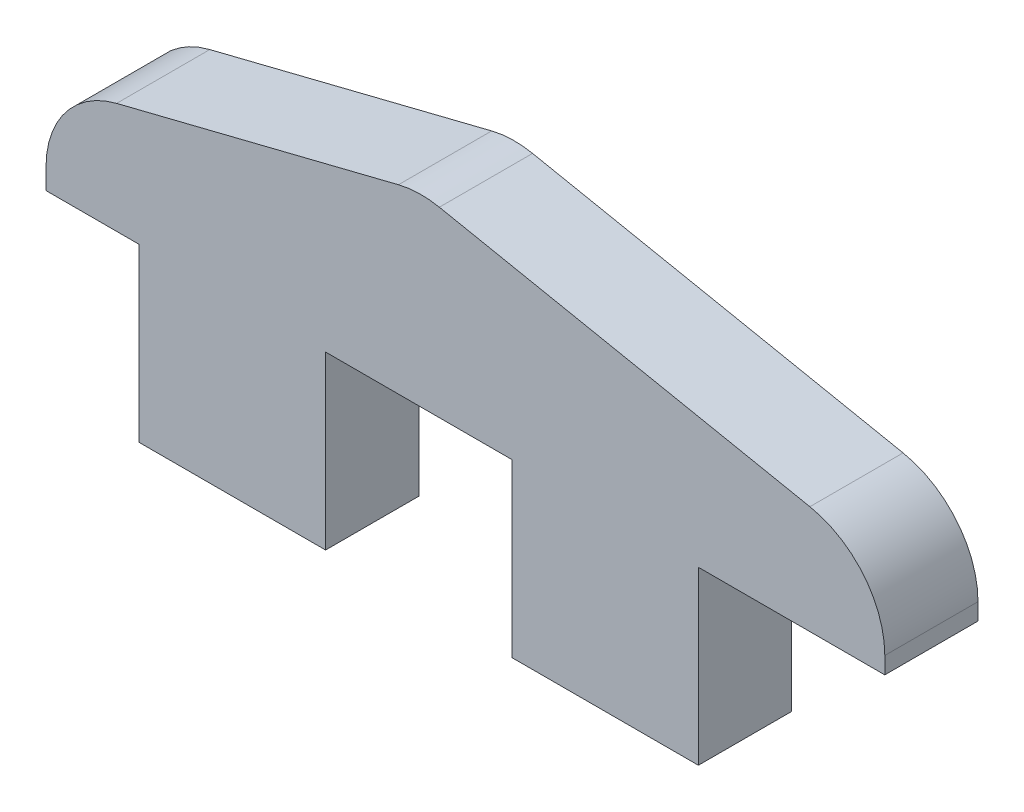
ISO-10303-21;
HEADER;
FILE_DESCRIPTION(('STEP AP214'),'2;1');
FILE_NAME('part.step','',(''),(''),'','','');
FILE_SCHEMA(('AUTOMOTIVE_DESIGN { 1 0 10303 214 1 1 1 1 }'));
ENDSEC;
DATA;
#1=APPLICATION_CONTEXT('core data for automotive mechanical design processes');
#2=APPLICATION_PROTOCOL_DEFINITION('international standard','automotive_design',2000,#1);
#3=PRODUCT_CONTEXT('',#1,'mechanical');
#4=PRODUCT('Part','Part','',(#3));
#5=PRODUCT_RELATED_PRODUCT_CATEGORY('part','',(#4));
#6=PRODUCT_DEFINITION_FORMATION('','',#4);
#7=PRODUCT_DEFINITION_CONTEXT('part definition',#1,'design');
#8=PRODUCT_DEFINITION('design','',#6,#7);
#9=PRODUCT_DEFINITION_SHAPE('','',#8);
#10=(LENGTH_UNIT() NAMED_UNIT(*) SI_UNIT(.MILLI.,.METRE.));
#11=(NAMED_UNIT(*) PLANE_ANGLE_UNIT() SI_UNIT($,.RADIAN.));
#12=(NAMED_UNIT(*) SI_UNIT($,.STERADIAN.) SOLID_ANGLE_UNIT());
#13=UNCERTAINTY_MEASURE_WITH_UNIT(LENGTH_MEASURE(1.E-05),#10,'distance_accuracy_value','');
#14=(GEOMETRIC_REPRESENTATION_CONTEXT(3) GLOBAL_UNCERTAINTY_ASSIGNED_CONTEXT((#13)) GLOBAL_UNIT_ASSIGNED_CONTEXT((#10,
#11,#12)) REPRESENTATION_CONTEXT('',''));
#15=CARTESIAN_POINT('',(0.,0.,0.));
#16=DIRECTION('',(0.,0.,1.));
#17=DIRECTION('',(1.,0.,0.));
#18=AXIS2_PLACEMENT_3D('',#15,#16,#17);
#19=CARTESIAN_POINT('',(0.,0.,3.175));
#20=DIRECTION('',(-1.,0.,0.));
#21=DIRECTION('',(0.,0.,1.));
#22=AXIS2_PLACEMENT_3D('',#19,#20,#21);
#23=PLANE('',#22);
#24=DIRECTION('',(0.,1.,0.));
#25=VECTOR('',#24,1.);
#26=CARTESIAN_POINT('',(0.,0.,0.));
#27=LINE('',#26,#25);
#28=CARTESIAN_POINT('',(0.,0.,0.));
#29=VERTEX_POINT('',#28);
#30=CARTESIAN_POINT('',(0.,5.842,0.));
#31=VERTEX_POINT('',#30);
#32=EDGE_CURVE('E172',#29,#31,#27,.T.);
#33=ORIENTED_EDGE('',*,*,#32,.T.);
#34=DIRECTION('',(0.,0.,-1.));
#35=VECTOR('',#34,1.);
#36=CARTESIAN_POINT('',(0.,5.842,3.175));
#37=LINE('',#36,#35);
#38=CARTESIAN_POINT('',(0.,5.842,3.175));
#39=VERTEX_POINT('',#38);
#40=EDGE_CURVE('E153',#39,#31,#37,.T.);
#41=ORIENTED_EDGE('',*,*,#40,.F.);
#42=DIRECTION('',(0.,1.,0.));
#43=VECTOR('',#42,1.);
#44=CARTESIAN_POINT('',(0.,0.,3.175));
#45=LINE('',#44,#43);
#46=CARTESIAN_POINT('',(0.,0.,3.175));
#47=VERTEX_POINT('',#46);
#48=EDGE_CURVE('E159',#47,#39,#45,.T.);
#49=ORIENTED_EDGE('',*,*,#48,.F.);
#50=DIRECTION('',(0.,0.,-1.));
#51=VECTOR('',#50,1.);
#52=CARTESIAN_POINT('',(0.,0.,3.175));
#53=LINE('',#52,#51);
#54=EDGE_CURVE('E225',#47,#29,#53,.T.);
#55=ORIENTED_EDGE('',*,*,#54,.T.);
#56=EDGE_LOOP('',(#33,#41,#49,#55));
#57=FACE_BOUND('',#56,.T.);
#58=ADVANCED_FACE('F35',(#57),#23,.F.);
#59=CARTESIAN_POINT('',(0.,5.842,3.175));
#60=DIRECTION('',(0.,1.,0.));
#61=DIRECTION('',(-1.,0.,0.));
#62=AXIS2_PLACEMENT_3D('',#59,#60,#61);
#63=PLANE('',#62);
#64=DIRECTION('',(1.,0.,0.));
#65=VECTOR('',#64,1.);
#66=CARTESIAN_POINT('',(0.,5.842,0.));
#67=LINE('',#66,#65);
#68=CARTESIAN_POINT('',(6.35,5.842,0.));
#69=VERTEX_POINT('',#68);
#70=EDGE_CURVE('E261',#31,#69,#67,.T.);
#71=ORIENTED_EDGE('',*,*,#70,.T.);
#72=DIRECTION('',(0.,0.,-1.));
#73=VECTOR('',#72,1.);
#74=CARTESIAN_POINT('',(6.35,5.842,3.175));
#75=LINE('',#74,#73);
#76=CARTESIAN_POINT('',(6.35,5.842,3.175));
#77=VERTEX_POINT('',#76);
#78=EDGE_CURVE('E156',#77,#69,#75,.T.);
#79=ORIENTED_EDGE('',*,*,#78,.F.);
#80=DIRECTION('',(1.,0.,0.));
#81=VECTOR('',#80,1.);
#82=CARTESIAN_POINT('',(0.,5.842,3.175));
#83=LINE('',#82,#81);
#84=EDGE_CURVE('E149',#39,#77,#83,.T.);
#85=ORIENTED_EDGE('',*,*,#84,.F.);
#86=ORIENTED_EDGE('',*,*,#40,.T.);
#87=EDGE_LOOP('',(#71,#79,#85,#86));
#88=FACE_BOUND('',#87,.T.);
#89=ADVANCED_FACE('F151',(#88),#63,.F.);
#90=CARTESIAN_POINT('',(6.35,0.,3.175));
#91=DIRECTION('',(1.,0.,0.));
#92=DIRECTION('',(0.,0.,-1.));
#93=AXIS2_PLACEMENT_3D('',#90,#91,#92);
#94=PLANE('',#93);
#95=DIRECTION('',(0.,-1.,0.));
#96=VECTOR('',#95,1.);
#97=CARTESIAN_POINT('',(6.35,0.,0.));
#98=LINE('',#97,#96);
#99=CARTESIAN_POINT('',(6.35,0.,0.));
#100=VERTEX_POINT('',#99);
#101=EDGE_CURVE('E255',#69,#100,#98,.T.);
#102=ORIENTED_EDGE('',*,*,#101,.T.);
#103=DIRECTION('',(0.,0.,-1.));
#104=VECTOR('',#103,1.);
#105=CARTESIAN_POINT('',(6.35,0.,3.175));
#106=LINE('',#105,#104);
#107=CARTESIAN_POINT('',(6.35,0.,3.175));
#108=VERTEX_POINT('',#107);
#109=EDGE_CURVE('E177',#108,#100,#106,.T.);
#110=ORIENTED_EDGE('',*,*,#109,.F.);
#111=DIRECTION('',(0.,-1.,0.));
#112=VECTOR('',#111,1.);
#113=CARTESIAN_POINT('',(6.35,0.,3.175));
#114=LINE('',#113,#112);
#115=EDGE_CURVE('E158',#77,#108,#114,.T.);
#116=ORIENTED_EDGE('',*,*,#115,.F.);
#117=ORIENTED_EDGE('',*,*,#78,.T.);
#118=EDGE_LOOP('',(#102,#110,#116,#117));
#119=FACE_BOUND('',#118,.T.);
#120=ADVANCED_FACE('F295',(#119),#94,.F.);
#121=CARTESIAN_POINT('',(6.35,0.,3.175));
#122=DIRECTION('',(0.,1.,0.));
#123=DIRECTION('',(0.,0.,1.));
#124=AXIS2_PLACEMENT_3D('',#121,#122,#123);
#125=PLANE('',#124);
#126=DIRECTION('',(1.,0.,0.));
#127=VECTOR('',#126,1.);
#128=CARTESIAN_POINT('',(6.35,0.,0.));
#129=LINE('',#128,#127);
#130=CARTESIAN_POINT('',(12.7,0.,0.));
#131=VERTEX_POINT('',#130);
#132=EDGE_CURVE('E250',#100,#131,#129,.T.);
#133=ORIENTED_EDGE('',*,*,#132,.T.);
#134=DIRECTION('',(0.,0.,-1.));
#135=VECTOR('',#134,1.);
#136=CARTESIAN_POINT('',(12.7,0.,3.175));
#137=LINE('',#136,#135);
#138=CARTESIAN_POINT('',(12.7,0.,3.175));
#139=VERTEX_POINT('',#138);
#140=EDGE_CURVE('E241',#139,#131,#137,.T.);
#141=ORIENTED_EDGE('',*,*,#140,.F.);
#142=DIRECTION('',(1.,0.,0.));
#143=VECTOR('',#142,1.);
#144=CARTESIAN_POINT('',(6.35,0.,3.175));
#145=LINE('',#144,#143);
#146=EDGE_CURVE('E251',#108,#139,#145,.T.);
#147=ORIENTED_EDGE('',*,*,#146,.F.);
#148=ORIENTED_EDGE('',*,*,#109,.T.);
#149=EDGE_LOOP('',(#133,#141,#147,#148));
#150=FACE_BOUND('',#149,.T.);
#151=ADVANCED_FACE('F248',(#150),#125,.F.);
#152=CARTESIAN_POINT('',(12.7,0.,3.175));
#153=DIRECTION('',(-1.,0.,0.));
#154=DIRECTION('',(0.,0.,1.));
#155=AXIS2_PLACEMENT_3D('',#152,#153,#154);
#156=PLANE('',#155);
#157=DIRECTION('',(0.,1.,0.));
#158=VECTOR('',#157,1.);
#159=CARTESIAN_POINT('',(12.7,0.,0.));
#160=LINE('',#159,#158);
#161=CARTESIAN_POINT('',(12.7,5.842,0.));
#162=VERTEX_POINT('',#161);
#163=EDGE_CURVE('E257',#131,#162,#160,.T.);
#164=ORIENTED_EDGE('',*,*,#163,.T.);
#165=DIRECTION('',(0.,0.,-1.));
#166=VECTOR('',#165,1.);
#167=CARTESIAN_POINT('',(12.7,5.842,3.175));
#168=LINE('',#167,#166);
#169=CARTESIAN_POINT('',(12.7,5.842,3.175));
#170=VERTEX_POINT('',#169);
#171=EDGE_CURVE('E238',#170,#162,#168,.T.);
#172=ORIENTED_EDGE('',*,*,#171,.F.);
#173=DIRECTION('',(0.,1.,0.));
#174=VECTOR('',#173,1.);
#175=CARTESIAN_POINT('',(12.7,0.,3.175));
#176=LINE('',#175,#174);
#177=EDGE_CURVE('E297',#139,#170,#176,.T.);
#178=ORIENTED_EDGE('',*,*,#177,.F.);
#179=ORIENTED_EDGE('',*,*,#140,.T.);
#180=EDGE_LOOP('',(#164,#172,#178,#179));
#181=FACE_BOUND('',#180,.T.);
#182=ADVANCED_FACE('F313',(#181),#156,.F.);
#183=CARTESIAN_POINT('',(12.7,5.842,3.175));
#184=DIRECTION('',(0.,1.,0.));
#185=DIRECTION('',(0.,0.,1.));
#186=AXIS2_PLACEMENT_3D('',#183,#184,#185);
#187=PLANE('',#186);
#188=DIRECTION('',(1.,0.,0.));
#189=VECTOR('',#188,1.);
#190=CARTESIAN_POINT('',(12.7,5.842,0.));
#191=LINE('',#190,#189);
#192=CARTESIAN_POINT('',(19.05,5.842,0.));
#193=VERTEX_POINT('',#192);
#194=EDGE_CURVE('E259',#162,#193,#191,.T.);
#195=ORIENTED_EDGE('',*,*,#194,.T.);
#196=DIRECTION('',(0.,0.,-1.));
#197=VECTOR('',#196,1.);
#198=CARTESIAN_POINT('',(19.05,5.842,3.175));
#199=LINE('',#198,#197);
#200=CARTESIAN_POINT('',(19.05,5.842,3.175));
#201=VERTEX_POINT('',#200);
#202=EDGE_CURVE('E235',#201,#193,#199,.T.);
#203=ORIENTED_EDGE('',*,*,#202,.F.);
#204=DIRECTION('',(1.,0.,0.));
#205=VECTOR('',#204,1.);
#206=CARTESIAN_POINT('',(12.7,5.842,3.175));
#207=LINE('',#206,#205);
#208=EDGE_CURVE('E301',#170,#201,#207,.T.);
#209=ORIENTED_EDGE('',*,*,#208,.F.);
#210=ORIENTED_EDGE('',*,*,#171,.T.);
#211=EDGE_LOOP('',(#195,#203,#209,#210));
#212=FACE_BOUND('',#211,.T.);
#213=ADVANCED_FACE('F309',(#212),#187,.F.);
#214=CARTESIAN_POINT('',(19.05,5.842,3.175));
#215=DIRECTION('',(-1.,0.,0.));
#216=DIRECTION('',(0.,0.,1.));
#217=AXIS2_PLACEMENT_3D('',#214,#215,#216);
#218=PLANE('',#217);
#219=DIRECTION('',(0.,1.,0.));
#220=VECTOR('',#219,1.);
#221=CARTESIAN_POINT('',(19.05,5.842,0.));
#222=LINE('',#221,#220);
#223=CARTESIAN_POINT('',(19.05,6.41412260886858,0.));
#224=VERTEX_POINT('',#223);
#225=EDGE_CURVE('E266',#193,#224,#222,.T.);
#226=ORIENTED_EDGE('',*,*,#225,.T.);
#227=DIRECTION('',(0.,0.,-1.));
#228=VECTOR('',#227,1.);
#229=CARTESIAN_POINT('',(19.05,6.41412260886858,3.175));
#230=LINE('',#229,#228);
#231=CARTESIAN_POINT('',(19.05,6.41412260886858,3.175));
#232=VERTEX_POINT('',#231);
#233=EDGE_CURVE('E11',#224,#232,#230,.F.);
#234=ORIENTED_EDGE('',*,*,#233,.T.);
#235=DIRECTION('',(0.,1.,0.));
#236=VECTOR('',#235,1.);
#237=CARTESIAN_POINT('',(19.05,5.842,3.175));
#238=LINE('',#237,#236);
#239=EDGE_CURVE('E287',#201,#232,#238,.T.);
#240=ORIENTED_EDGE('',*,*,#239,.F.);
#241=ORIENTED_EDGE('',*,*,#202,.T.);
#242=EDGE_LOOP('',(#226,#234,#240,#241));
#243=FACE_BOUND('',#242,.T.);
#244=ADVANCED_FACE('F307',(#243),#218,.F.);
#245=CARTESIAN_POINT('',(19.05,9.017,3.175));
#246=DIRECTION('',(-0.196116135138184,-0.98058067569092,0.));
#247=DIRECTION('',(0.98058067569092,-0.196116135138184,0.));
#248=AXIS2_PLACEMENT_3D('',#245,#246,#247);
#249=PLANE('',#248);
#250=DIRECTION('',(-0.98058067569092,0.196116135138184,0.));
#251=VECTOR('',#250,1.);
#252=CARTESIAN_POINT('',(19.05,9.017,0.));
#253=LINE('',#252,#251);
#254=CARTESIAN_POINT('',(16.4976687290637,9.52746625418725,0.));
#255=VERTEX_POINT('',#254);
#256=CARTESIAN_POINT('',(3.87508583840284,12.0519828323194,0.));
#257=VERTEX_POINT('',#256);
#258=EDGE_CURVE('E219',#255,#257,#253,.T.);
#259=ORIENTED_EDGE('',*,*,#258,.T.);
#260=DIRECTION('',(0.,0.,-1.));
#261=VECTOR('',#260,1.);
#262=CARTESIAN_POINT('',(3.87508583840284,12.0519828323194,3.175));
#263=LINE('',#262,#261);
#264=CARTESIAN_POINT('',(3.87508583840284,12.0519828323194,3.175));
#265=VERTEX_POINT('',#264);
#266=EDGE_CURVE('E192',#257,#265,#263,.F.);
#267=ORIENTED_EDGE('',*,*,#266,.T.);
#268=DIRECTION('',(-0.98058067569092,0.196116135138184,0.));
#269=VECTOR('',#268,1.);
#270=CARTESIAN_POINT('',(19.05,9.017,3.175));
#271=LINE('',#270,#269);
#272=CARTESIAN_POINT('',(16.4976687290637,9.52746625418725,3.175));
#273=VERTEX_POINT('',#272);
#274=EDGE_CURVE('E280',#273,#265,#271,.T.);
#275=ORIENTED_EDGE('',*,*,#274,.F.);
#276=DIRECTION('',(0.,0.,-1.));
#277=VECTOR('',#276,1.);
#278=CARTESIAN_POINT('',(16.4976687290637,9.52746625418725,3.175));
#279=LINE('',#278,#277);
#280=EDGE_CURVE('E189',#273,#255,#279,.T.);
#281=ORIENTED_EDGE('',*,*,#280,.T.);
#282=EDGE_LOOP('',(#259,#267,#275,#281));
#283=FACE_BOUND('',#282,.T.);
#284=ADVANCED_FACE('F271',(#283),#249,.F.);
#285=CARTESIAN_POINT('',(-9.525,9.017,3.175));
#286=DIRECTION('',(0.242535625036333,-0.970142500145332,0.));
#287=DIRECTION('',(0.970142500145332,0.242535625036333,0.));
#288=AXIS2_PLACEMENT_3D('',#285,#286,#287);
#289=PLANE('',#288);
#290=DIRECTION('',(-0.970142500145332,-0.242535625036333,0.));
#291=VECTOR('',#290,1.);
#292=CARTESIAN_POINT('',(-9.525,9.017,3.175));
#293=LINE('',#292,#291);
#294=CARTESIAN_POINT('',(2.48236649984875,12.0188416249622,3.175));
#295=VERTEX_POINT('',#294);
#296=CARTESIAN_POINT('',(-7.12005060949036,9.61823734762741,3.175));
#297=VERTEX_POINT('',#296);
#298=EDGE_CURVE('E279',#295,#297,#293,.T.);
#299=ORIENTED_EDGE('',*,*,#298,.F.);
#300=DIRECTION('',(0.,0.,-1.));
#301=VECTOR('',#300,1.);
#302=CARTESIAN_POINT('',(2.48236649984875,12.0188416249622,3.175));
#303=LINE('',#302,#301);
#304=CARTESIAN_POINT('',(2.48236649984875,12.0188416249622,0.));
#305=VERTEX_POINT('',#304);
#306=EDGE_CURVE('E175',#295,#305,#303,.T.);
#307=ORIENTED_EDGE('',*,*,#306,.T.);
#308=DIRECTION('',(-0.970142500145332,-0.242535625036333,0.));
#309=VECTOR('',#308,1.);
#310=CARTESIAN_POINT('',(-9.525,9.017,0.));
#311=LINE('',#310,#309);
#312=CARTESIAN_POINT('',(-7.12005060949036,9.61823734762741,0.));
#313=VERTEX_POINT('',#312);
#314=EDGE_CURVE('E215',#305,#313,#311,.T.);
#315=ORIENTED_EDGE('',*,*,#314,.T.);
#316=DIRECTION('',(0.,0.,-1.));
#317=VECTOR('',#316,1.);
#318=CARTESIAN_POINT('',(-7.12005060949036,9.61823734762741,3.175));
#319=LINE('',#318,#317);
#320=EDGE_CURVE('E173',#313,#297,#319,.F.);
#321=ORIENTED_EDGE('',*,*,#320,.T.);
#322=EDGE_LOOP('',(#299,#307,#315,#321));
#323=FACE_BOUND('',#322,.T.);
#324=ADVANCED_FACE('F282',(#323),#289,.F.);
#325=CARTESIAN_POINT('',(-9.525,5.842,3.175));
#326=DIRECTION('',(1.,0.,0.));
#327=DIRECTION('',(0.,0.,-1.));
#328=AXIS2_PLACEMENT_3D('',#325,#326,#327);
#329=PLANE('',#328);
#330=DIRECTION('',(0.,-1.,0.));
#331=VECTOR('',#330,1.);
#332=CARTESIAN_POINT('',(-9.525,5.842,3.175));
#333=LINE('',#332,#331);
#334=CARTESIAN_POINT('',(-9.525,6.53803490966598,3.175));
#335=VERTEX_POINT('',#334);
#336=CARTESIAN_POINT('',(-9.525,5.842,3.175));
#337=VERTEX_POINT('',#336);
#338=EDGE_CURVE('E206',#335,#337,#333,.T.);
#339=ORIENTED_EDGE('',*,*,#338,.F.);
#340=DIRECTION('',(0.,0.,-1.));
#341=VECTOR('',#340,1.);
#342=CARTESIAN_POINT('',(-9.525,6.53803490966598,3.175));
#343=LINE('',#342,#341);
#344=CARTESIAN_POINT('',(-9.525,6.53803490966598,0.));
#345=VERTEX_POINT('',#344);
#346=EDGE_CURVE('E43',#335,#345,#343,.T.);
#347=ORIENTED_EDGE('',*,*,#346,.T.);
#348=DIRECTION('',(0.,-1.,0.));
#349=VECTOR('',#348,1.);
#350=CARTESIAN_POINT('',(-9.525,5.842,0.));
#351=LINE('',#350,#349);
#352=CARTESIAN_POINT('',(-9.525,5.842,0.));
#353=VERTEX_POINT('',#352);
#354=EDGE_CURVE('E204',#345,#353,#351,.T.);
#355=ORIENTED_EDGE('',*,*,#354,.T.);
#356=DIRECTION('',(0.,0.,-1.));
#357=VECTOR('',#356,1.);
#358=CARTESIAN_POINT('',(-9.525,5.842,3.175));
#359=LINE('',#358,#357);
#360=EDGE_CURVE('E233',#337,#353,#359,.T.);
#361=ORIENTED_EDGE('',*,*,#360,.F.);
#362=EDGE_LOOP('',(#339,#347,#355,#361));
#363=FACE_BOUND('',#362,.T.);
#364=ADVANCED_FACE('F202',(#363),#329,.F.);
#365=CARTESIAN_POINT('',(-6.35,5.842,3.175));
#366=DIRECTION('',(0.,1.,0.));
#367=DIRECTION('',(-1.,0.,0.));
#368=AXIS2_PLACEMENT_3D('',#365,#366,#367);
#369=PLANE('',#368);
#370=DIRECTION('',(1.,0.,0.));
#371=VECTOR('',#370,1.);
#372=CARTESIAN_POINT('',(-6.35,5.842,0.));
#373=LINE('',#372,#371);
#374=CARTESIAN_POINT('',(-6.35,5.842,0.));
#375=VERTEX_POINT('',#374);
#376=EDGE_CURVE('E214',#353,#375,#373,.T.);
#377=ORIENTED_EDGE('',*,*,#376,.T.);
#378=DIRECTION('',(0.,0.,-1.));
#379=VECTOR('',#378,1.);
#380=CARTESIAN_POINT('',(-6.35,5.842,3.175));
#381=LINE('',#380,#379);
#382=CARTESIAN_POINT('',(-6.35,5.842,3.175));
#383=VERTEX_POINT('',#382);
#384=EDGE_CURVE('E230',#383,#375,#381,.T.);
#385=ORIENTED_EDGE('',*,*,#384,.F.);
#386=DIRECTION('',(1.,0.,0.));
#387=VECTOR('',#386,1.);
#388=CARTESIAN_POINT('',(-6.35,5.842,3.175));
#389=LINE('',#388,#387);
#390=EDGE_CURVE('E285',#337,#383,#389,.T.);
#391=ORIENTED_EDGE('',*,*,#390,.F.);
#392=ORIENTED_EDGE('',*,*,#360,.T.);
#393=EDGE_LOOP('',(#377,#385,#391,#392));
#394=FACE_BOUND('',#393,.T.);
#395=ADVANCED_FACE('F377',(#394),#369,.F.);
#396=CARTESIAN_POINT('',(-6.35,0.,3.175));
#397=DIRECTION('',(1.,0.,0.));
#398=DIRECTION('',(0.,0.,-1.));
#399=AXIS2_PLACEMENT_3D('',#396,#397,#398);
#400=PLANE('',#399);
#401=DIRECTION('',(0.,-1.,0.));
#402=VECTOR('',#401,1.);
#403=CARTESIAN_POINT('',(-6.35,0.,0.));
#404=LINE('',#403,#402);
#405=CARTESIAN_POINT('',(-6.35,0.,0.));
#406=VERTEX_POINT('',#405);
#407=EDGE_CURVE('E217',#375,#406,#404,.T.);
#408=ORIENTED_EDGE('',*,*,#407,.T.);
#409=DIRECTION('',(0.,0.,-1.));
#410=VECTOR('',#409,1.);
#411=CARTESIAN_POINT('',(-6.35,0.,3.175));
#412=LINE('',#411,#410);
#413=CARTESIAN_POINT('',(-6.35,0.,3.175));
#414=VERTEX_POINT('',#413);
#415=EDGE_CURVE('E227',#414,#406,#412,.T.);
#416=ORIENTED_EDGE('',*,*,#415,.F.);
#417=DIRECTION('',(0.,-1.,0.));
#418=VECTOR('',#417,1.);
#419=CARTESIAN_POINT('',(-6.35,0.,3.175));
#420=LINE('',#419,#418);
#421=EDGE_CURVE('E292',#383,#414,#420,.T.);
#422=ORIENTED_EDGE('',*,*,#421,.F.);
#423=ORIENTED_EDGE('',*,*,#384,.T.);
#424=EDGE_LOOP('',(#408,#416,#422,#423));
#425=FACE_BOUND('',#424,.T.);
#426=ADVANCED_FACE('F412',(#425),#400,.F.);
#427=CARTESIAN_POINT('',(0.,0.,3.175));
#428=DIRECTION('',(0.,1.,0.));
#429=DIRECTION('',(-1.,0.,0.));
#430=AXIS2_PLACEMENT_3D('',#427,#428,#429);
#431=PLANE('',#430);
#432=DIRECTION('',(1.,0.,0.));
#433=VECTOR('',#432,1.);
#434=CARTESIAN_POINT('',(0.,0.,0.));
#435=LINE('',#434,#433);
#436=EDGE_CURVE('E169',#406,#29,#435,.T.);
#437=ORIENTED_EDGE('',*,*,#436,.T.);
#438=ORIENTED_EDGE('',*,*,#54,.F.);
#439=DIRECTION('',(1.,0.,0.));
#440=VECTOR('',#439,1.);
#441=CARTESIAN_POINT('',(0.,0.,3.175));
#442=LINE('',#441,#440);
#443=EDGE_CURVE('E165',#414,#47,#442,.T.);
#444=ORIENTED_EDGE('',*,*,#443,.F.);
#445=ORIENTED_EDGE('',*,*,#415,.T.);
#446=EDGE_LOOP('',(#437,#438,#444,#445));
#447=FACE_BOUND('',#446,.T.);
#448=ADVANCED_FACE('F367',(#447),#431,.F.);
#449=CARTESIAN_POINT('',(0.,0.,3.175));
#450=DIRECTION('',(0.,0.,-1.));
#451=DIRECTION('',(-1.,0.,0.));
#452=AXIS2_PLACEMENT_3D('',#449,#450,#451);
#453=PLANE('',#452);
#454=ORIENTED_EDGE('',*,*,#274,.T.);
#455=CARTESIAN_POINT('',(3.25241710933911,8.93863918700076,3.175));
#456=DIRECTION('',(0.,0.,-1.));
#457=DIRECTION('',(-1.,0.,0.));
#458=AXIS2_PLACEMENT_3D('',#455,#456,#457);
#459=CIRCLE('',#458,3.175);
#460=EDGE_CURVE('E197',#265,#295,#459,.F.);
#461=ORIENTED_EDGE('',*,*,#460,.T.);
#462=ORIENTED_EDGE('',*,*,#298,.T.);
#463=CARTESIAN_POINT('',(-6.35,6.53803490966598,3.175));
#464=DIRECTION('',(0.,0.,-1.));
#465=DIRECTION('',(-1.,0.,0.));
#466=AXIS2_PLACEMENT_3D('',#463,#464,#465);
#467=CIRCLE('',#466,3.175);
#468=EDGE_CURVE('E50',#297,#335,#467,.F.);
#469=ORIENTED_EDGE('',*,*,#468,.T.);
#470=ORIENTED_EDGE('',*,*,#338,.T.);
#471=ORIENTED_EDGE('',*,*,#390,.T.);
#472=ORIENTED_EDGE('',*,*,#421,.T.);
#473=ORIENTED_EDGE('',*,*,#443,.T.);
#474=ORIENTED_EDGE('',*,*,#48,.T.);
#475=ORIENTED_EDGE('',*,*,#84,.T.);
#476=ORIENTED_EDGE('',*,*,#115,.T.);
#477=ORIENTED_EDGE('',*,*,#146,.T.);
#478=ORIENTED_EDGE('',*,*,#177,.T.);
#479=ORIENTED_EDGE('',*,*,#208,.T.);
#480=ORIENTED_EDGE('',*,*,#239,.T.);
#481=CARTESIAN_POINT('',(15.875,6.41412260886858,3.175));
#482=DIRECTION('',(0.,0.,-1.));
#483=DIRECTION('',(-1.,0.,0.));
#484=AXIS2_PLACEMENT_3D('',#481,#482,#483);
#485=CIRCLE('',#484,3.175);
#486=EDGE_CURVE('E194',#232,#273,#485,.F.);
#487=ORIENTED_EDGE('',*,*,#486,.T.);
#488=EDGE_LOOP('',(#454,#461,#462,#469,#470,#471,#472,#473,#474,#475,#476,#477,#478,#479,#480,#487));
#489=FACE_BOUND('',#488,.T.);
#490=ADVANCED_FACE('F163',(#489),#453,.F.);
#491=CARTESIAN_POINT('',(0.,0.,0.));
#492=DIRECTION('',(0.,0.,-1.));
#493=DIRECTION('',(-1.,0.,0.));
#494=AXIS2_PLACEMENT_3D('',#491,#492,#493);
#495=PLANE('',#494);
#496=ORIENTED_EDGE('',*,*,#314,.F.);
#497=CARTESIAN_POINT('',(3.25241710933911,8.93863918700076,0.));
#498=DIRECTION('',(0.,0.,-1.));
#499=DIRECTION('',(-1.,0.,0.));
#500=AXIS2_PLACEMENT_3D('',#497,#498,#499);
#501=CIRCLE('',#500,3.175);
#502=EDGE_CURVE('E187',#305,#257,#501,.T.);
#503=ORIENTED_EDGE('',*,*,#502,.T.);
#504=ORIENTED_EDGE('',*,*,#258,.F.);
#505=CARTESIAN_POINT('',(15.875,6.41412260886858,0.));
#506=DIRECTION('',(0.,0.,-1.));
#507=DIRECTION('',(-1.,0.,0.));
#508=AXIS2_PLACEMENT_3D('',#505,#506,#507);
#509=CIRCLE('',#508,3.175);
#510=EDGE_CURVE('E183',#255,#224,#509,.T.);
#511=ORIENTED_EDGE('',*,*,#510,.T.);
#512=ORIENTED_EDGE('',*,*,#225,.F.);
#513=ORIENTED_EDGE('',*,*,#194,.F.);
#514=ORIENTED_EDGE('',*,*,#163,.F.);
#515=ORIENTED_EDGE('',*,*,#132,.F.);
#516=ORIENTED_EDGE('',*,*,#101,.F.);
#517=ORIENTED_EDGE('',*,*,#70,.F.);
#518=ORIENTED_EDGE('',*,*,#32,.F.);
#519=ORIENTED_EDGE('',*,*,#436,.F.);
#520=ORIENTED_EDGE('',*,*,#407,.F.);
#521=ORIENTED_EDGE('',*,*,#376,.F.);
#522=ORIENTED_EDGE('',*,*,#354,.F.);
#523=CARTESIAN_POINT('',(-6.35,6.53803490966598,0.));
#524=DIRECTION('',(0.,0.,-1.));
#525=DIRECTION('',(-1.,0.,0.));
#526=AXIS2_PLACEMENT_3D('',#523,#524,#525);
#527=CIRCLE('',#526,3.175);
#528=EDGE_CURVE('E185',#345,#313,#527,.T.);
#529=ORIENTED_EDGE('',*,*,#528,.T.);
#530=EDGE_LOOP('',(#496,#503,#504,#511,#512,#513,#514,#515,#516,#517,#518,#519,#520,#521,#522,#529));
#531=FACE_BOUND('',#530,.T.);
#532=ADVANCED_FACE('F211',(#531),#495,.T.);
#533=CARTESIAN_POINT('',(3.25241710933911,8.93863918700076,3.175));
#534=DIRECTION('',(0.,0.,-1.));
#535=DIRECTION('',(-1.,0.,0.));
#536=AXIS2_PLACEMENT_3D('',#533,#534,#535);
#537=CYLINDRICAL_SURFACE('',#536,3.175);
#538=ORIENTED_EDGE('',*,*,#460,.F.);
#539=ORIENTED_EDGE('',*,*,#266,.F.);
#540=ORIENTED_EDGE('',*,*,#502,.F.);
#541=ORIENTED_EDGE('',*,*,#306,.F.);
#542=EDGE_LOOP('',(#538,#539,#540,#541));
#543=FACE_BOUND('',#542,.T.);
#544=ADVANCED_FACE('F276',(#543),#537,.T.);
#545=CARTESIAN_POINT('',(-6.35,6.53803490966598,3.175));
#546=DIRECTION('',(0.,0.,-1.));
#547=DIRECTION('',(-1.,0.,0.));
#548=AXIS2_PLACEMENT_3D('',#545,#546,#547);
#549=CYLINDRICAL_SURFACE('',#548,3.175);
#550=ORIENTED_EDGE('',*,*,#468,.F.);
#551=ORIENTED_EDGE('',*,*,#320,.F.);
#552=ORIENTED_EDGE('',*,*,#528,.F.);
#553=ORIENTED_EDGE('',*,*,#346,.F.);
#554=EDGE_LOOP('',(#550,#551,#552,#553));
#555=FACE_BOUND('',#554,.T.);
#556=ADVANCED_FACE('F331',(#555),#549,.T.);
#557=CARTESIAN_POINT('',(15.875,6.41412260886858,3.175));
#558=DIRECTION('',(0.,0.,-1.));
#559=DIRECTION('',(-1.,0.,0.));
#560=AXIS2_PLACEMENT_3D('',#557,#558,#559);
#561=CYLINDRICAL_SURFACE('',#560,3.175);
#562=ORIENTED_EDGE('',*,*,#486,.F.);
#563=ORIENTED_EDGE('',*,*,#233,.F.);
#564=ORIENTED_EDGE('',*,*,#510,.F.);
#565=ORIENTED_EDGE('',*,*,#280,.F.);
#566=EDGE_LOOP('',(#562,#563,#564,#565));
#567=FACE_BOUND('',#566,.T.);
#568=ADVANCED_FACE('F37',(#567),#561,.T.);
#569=CLOSED_SHELL('',(#58,#89,#120,#151,#182,#213,#244,#284,#324,#364,#395,#426,#448,#490,#532,
#544,#556,#568));
#570=MANIFOLD_SOLID_BREP('B2',#569);
#571=ADVANCED_BREP_SHAPE_REPRESENTATION('',(#18,#570),#14);
#572=SHAPE_DEFINITION_REPRESENTATION(#9,#571);
ENDSEC;
END-ISO-10303-21;
